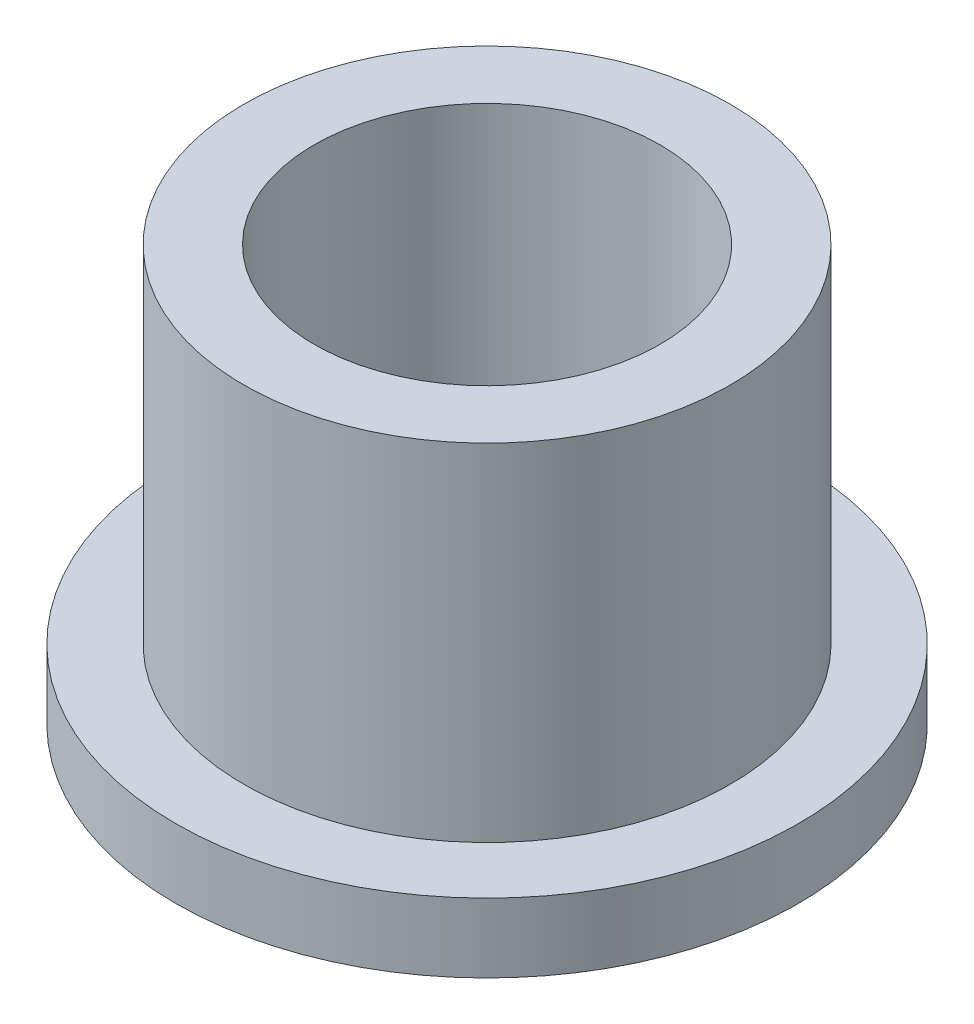
ISO-10303-21;
HEADER;
FILE_DESCRIPTION(('STEP AP214'),'2;1');
FILE_NAME('part.step','',(''),(''),'','','');
FILE_SCHEMA(('AUTOMOTIVE_DESIGN { 1 0 10303 214 1 1 1 1 }'));
ENDSEC;
DATA;
#1=APPLICATION_CONTEXT('core data for automotive mechanical design processes');
#2=APPLICATION_PROTOCOL_DEFINITION('international standard','automotive_design',2000,#1);
#3=PRODUCT_CONTEXT('',#1,'mechanical');
#4=PRODUCT('Part','Part','',(#3));
#5=PRODUCT_RELATED_PRODUCT_CATEGORY('part','',(#4));
#6=PRODUCT_DEFINITION_FORMATION('','',#4);
#7=PRODUCT_DEFINITION_CONTEXT('part definition',#1,'design');
#8=PRODUCT_DEFINITION('design','',#6,#7);
#9=PRODUCT_DEFINITION_SHAPE('','',#8);
#10=(LENGTH_UNIT() NAMED_UNIT(*) SI_UNIT(.MILLI.,.METRE.));
#11=(NAMED_UNIT(*) PLANE_ANGLE_UNIT() SI_UNIT($,.RADIAN.));
#12=(NAMED_UNIT(*) SI_UNIT($,.STERADIAN.) SOLID_ANGLE_UNIT());
#13=UNCERTAINTY_MEASURE_WITH_UNIT(LENGTH_MEASURE(1.E-05),#10,'distance_accuracy_value','');
#14=(GEOMETRIC_REPRESENTATION_CONTEXT(3) GLOBAL_UNCERTAINTY_ASSIGNED_CONTEXT((#13)) GLOBAL_UNIT_ASSIGNED_CONTEXT((#10,
#11,#12)) REPRESENTATION_CONTEXT('',''));
#15=CARTESIAN_POINT('',(0.,0.,0.));
#16=DIRECTION('',(0.,0.,1.));
#17=DIRECTION('',(1.,0.,0.));
#18=AXIS2_PLACEMENT_3D('',#15,#16,#17);
#19=CARTESIAN_POINT('',(0.,9.525,0.));
#20=DIRECTION('',(0.,1.,0.));
#21=DIRECTION('',(0.,0.,1.));
#22=AXIS2_PLACEMENT_3D('',#19,#20,#21);
#23=PLANE('',#22);
#24=CARTESIAN_POINT('',(0.,9.525,0.));
#25=DIRECTION('',(0.,1.,0.));
#26=DIRECTION('',(0.,0.,1.));
#27=AXIS2_PLACEMENT_3D('',#24,#25,#26);
#28=CIRCLE('',#27,5.58165);
#29=CARTESIAN_POINT('',(0.,9.525,-5.58165));
#30=VERTEX_POINT('',#29);
#31=EDGE_CURVE('E10',#30,#30,#28,.T.);
#32=ORIENTED_EDGE('',*,*,#31,.T.);
#33=EDGE_LOOP('',(#32));
#34=FACE_BOUND('',#33,.T.);
#35=CARTESIAN_POINT('',(0.,9.525,0.));
#36=DIRECTION('',(0.,1.,0.));
#37=DIRECTION('',(0.,0.,1.));
#38=AXIS2_PLACEMENT_3D('',#35,#36,#37);
#39=CIRCLE('',#38,3.96875);
#40=CARTESIAN_POINT('',(0.,9.525,-3.96875));
#41=VERTEX_POINT('',#40);
#42=EDGE_CURVE('E39',#41,#41,#39,.T.);
#43=ORIENTED_EDGE('',*,*,#42,.F.);
#44=EDGE_LOOP('',(#43));
#45=FACE_BOUND('',#44,.T.);
#46=ADVANCED_FACE('F32',(#34,#45),#23,.T.);
#47=CARTESIAN_POINT('',(0.,0.,0.));
#48=DIRECTION('',(0.,1.,0.));
#49=DIRECTION('',(0.,0.,1.));
#50=AXIS2_PLACEMENT_3D('',#47,#48,#49);
#51=PLANE('',#50);
#52=CARTESIAN_POINT('',(0.,0.,0.));
#53=DIRECTION('',(0.,1.,0.));
#54=DIRECTION('',(0.,0.,1.));
#55=AXIS2_PLACEMENT_3D('',#52,#53,#54);
#56=CIRCLE('',#55,3.96875);
#57=CARTESIAN_POINT('',(0.,0.,-3.96875));
#58=VERTEX_POINT('',#57);
#59=EDGE_CURVE('E43',#58,#58,#56,.T.);
#60=ORIENTED_EDGE('',*,*,#59,.T.);
#61=EDGE_LOOP('',(#60));
#62=FACE_BOUND('',#61,.T.);
#63=CARTESIAN_POINT('',(0.,0.,0.));
#64=DIRECTION('',(0.,1.,0.));
#65=DIRECTION('',(0.,0.,1.));
#66=AXIS2_PLACEMENT_3D('',#63,#64,#65);
#67=CIRCLE('',#66,7.14375);
#68=CARTESIAN_POINT('',(0.,0.,7.14375));
#69=VERTEX_POINT('',#68);
#70=EDGE_CURVE('E50',#69,#69,#67,.T.);
#71=ORIENTED_EDGE('',*,*,#70,.F.);
#72=EDGE_LOOP('',(#71));
#73=FACE_BOUND('',#72,.T.);
#74=ADVANCED_FACE('F75',(#62,#73),#51,.F.);
#75=CARTESIAN_POINT('',(0.,9.525,0.));
#76=DIRECTION('',(0.,-1.,0.));
#77=DIRECTION('',(0.,0.,-1.));
#78=AXIS2_PLACEMENT_3D('',#75,#76,#77);
#79=CYLINDRICAL_SURFACE('',#78,5.58165);
#80=CARTESIAN_POINT('',(0.,1.5875,0.));
#81=DIRECTION('',(0.,1.,0.));
#82=DIRECTION('',(0.,0.,1.));
#83=AXIS2_PLACEMENT_3D('',#80,#81,#82);
#84=CIRCLE('',#83,5.58165);
#85=CARTESIAN_POINT('',(0.,1.5875,-5.58165));
#86=VERTEX_POINT('',#85);
#87=EDGE_CURVE('E53',#86,#86,#84,.T.);
#88=CARTESIAN_POINT('',(0.,1.5875,-5.58165));
#89=CARTESIAN_POINT('',(0.,1.67018229166667,-5.58165));
#90=CARTESIAN_POINT('',(0.,1.75286458333333,-5.58165));
#91=CARTESIAN_POINT('',(0.,1.91822916666666,-5.58165));
#92=CARTESIAN_POINT('',(0.,2.00091145833333,-5.58165));
#93=CARTESIAN_POINT('',(0.,2.16627604166666,-5.58165));
#94=CARTESIAN_POINT('',(0.,2.24895833333333,-5.58165));
#95=CARTESIAN_POINT('',(0.,2.41432291666667,-5.58165));
#96=CARTESIAN_POINT('',(0.,2.49700520833333,-5.58165));
#97=CARTESIAN_POINT('',(0.,2.66236979166666,-5.58165));
#98=CARTESIAN_POINT('',(0.,2.74505208333333,-5.58165));
#99=CARTESIAN_POINT('',(0.,2.91041666666667,-5.58165));
#100=CARTESIAN_POINT('',(0.,2.99309895833333,-5.58165));
#101=CARTESIAN_POINT('',(0.,3.15846354166667,-5.58165));
#102=CARTESIAN_POINT('',(0.,3.24114583333333,-5.58165));
#103=CARTESIAN_POINT('',(0.,3.40651041666667,-5.58165));
#104=CARTESIAN_POINT('',(0.,3.48919270833333,-5.58165));
#105=CARTESIAN_POINT('',(0.,3.65455729166666,-5.58165));
#106=CARTESIAN_POINT('',(0.,3.73723958333333,-5.58165));
#107=CARTESIAN_POINT('',(0.,3.90260416666667,-5.58165));
#108=CARTESIAN_POINT('',(0.,3.98528645833333,-5.58165));
#109=CARTESIAN_POINT('',(0.,4.15065104166666,-5.58165));
#110=CARTESIAN_POINT('',(0.,4.23333333333333,-5.58165));
#111=CARTESIAN_POINT('',(0.,4.39869791666667,-5.58165));
#112=CARTESIAN_POINT('',(0.,4.48138020833333,-5.58165));
#113=CARTESIAN_POINT('',(0.,4.64674479166667,-5.58165));
#114=CARTESIAN_POINT('',(0.,4.72942708333333,-5.58165));
#115=CARTESIAN_POINT('',(0.,4.89479166666667,-5.58165));
#116=CARTESIAN_POINT('',(0.,4.97747395833333,-5.58165));
#117=CARTESIAN_POINT('',(0.,5.14283854166666,-5.58165));
#118=CARTESIAN_POINT('',(0.,5.22552083333333,-5.58165));
#119=CARTESIAN_POINT('',(0.,5.39088541666667,-5.58165));
#120=CARTESIAN_POINT('',(0.,5.47356770833333,-5.58165));
#121=CARTESIAN_POINT('',(0.,5.63893229166666,-5.58165));
#122=CARTESIAN_POINT('',(0.,5.72161458333333,-5.58165));
#123=CARTESIAN_POINT('',(0.,5.88697916666666,-5.58165));
#124=CARTESIAN_POINT('',(0.,5.96966145833333,-5.58165));
#125=CARTESIAN_POINT('',(0.,6.13502604166666,-5.58165));
#126=CARTESIAN_POINT('',(0.,6.21770833333333,-5.58165));
#127=CARTESIAN_POINT('',(0.,6.38307291666667,-5.58165));
#128=CARTESIAN_POINT('',(0.,6.46575520833333,-5.58165));
#129=CARTESIAN_POINT('',(0.,6.63111979166666,-5.58165));
#130=CARTESIAN_POINT('',(0.,6.71380208333333,-5.58165));
#131=CARTESIAN_POINT('',(0.,6.87916666666666,-5.58165));
#132=CARTESIAN_POINT('',(0.,6.96184895833333,-5.58165));
#133=CARTESIAN_POINT('',(0.,7.12721354166666,-5.58165));
#134=CARTESIAN_POINT('',(0.,7.20989583333333,-5.58165));
#135=CARTESIAN_POINT('',(0.,7.37526041666667,-5.58165));
#136=CARTESIAN_POINT('',(0.,7.45794270833333,-5.58165));
#137=CARTESIAN_POINT('',(0.,7.62330729166666,-5.58165));
#138=CARTESIAN_POINT('',(0.,7.70598958333333,-5.58165));
#139=CARTESIAN_POINT('',(0.,7.87135416666667,-5.58165));
#140=CARTESIAN_POINT('',(0.,7.95403645833333,-5.58165));
#141=CARTESIAN_POINT('',(0.,8.11940104166667,-5.58165));
#142=CARTESIAN_POINT('',(0.,8.20208333333333,-5.58165));
#143=CARTESIAN_POINT('',(0.,8.36744791666667,-5.58165));
#144=CARTESIAN_POINT('',(0.,8.45013020833333,-5.58165));
#145=CARTESIAN_POINT('',(0.,8.61549479166667,-5.58165));
#146=CARTESIAN_POINT('',(0.,8.69817708333333,-5.58165));
#147=CARTESIAN_POINT('',(0.,8.86354166666666,-5.58165));
#148=CARTESIAN_POINT('',(0.,8.94622395833333,-5.58165));
#149=CARTESIAN_POINT('',(0.,9.11158854166667,-5.58165));
#150=CARTESIAN_POINT('',(0.,9.19427083333333,-5.58165));
#151=CARTESIAN_POINT('',(0.,9.35963541666667,-5.58165));
#152=CARTESIAN_POINT('',(0.,9.44231770833333,-5.58165));
#153=CARTESIAN_POINT('',(0.,9.525,-5.58165));
#154=B_SPLINE_CURVE_WITH_KNOTS('',3,(#88,#89,#90,#91,#92,#93,#94,#95,#96,#97,#98,#99,#100,#101,
#102,#103,#104,#105,#106,#107,#108,#109,#110,#111,#112,#113,#114,#115,#116,#117,#118,#119,#120,
#121,#122,#123,#124,#125,#126,#127,#128,#129,#130,#131,#132,#133,#134,#135,#136,#137,#138,#139,
#140,#141,#142,#143,#144,#145,#146,#147,#148,#149,#150,#151,#152,#153),.UNSPECIFIED.,.F.,.F.,(4,
2,2,2,2,2,2,2,2,2,2,2,2,2,2,2,2,2,2,2,2,2,2,2,2,2,2,2,2,2,2,2,4),(0.,0.248046875,
0.496093749999999,0.744140625,0.992187499999999,1.240234375,1.48828125,1.736328125,1.984375,
2.232421875,2.48046875,2.728515625,2.9765625,3.224609375,3.47265625,3.720703125,3.96875,
4.216796875,4.46484375,4.712890625,4.9609375,5.208984375,5.45703125,5.705078125,5.953125,
6.201171875,6.44921875,6.697265625,6.9453125,7.193359375,7.44140625,7.689453125,7.9375),.UNSPECIFIED.);
#155=EDGE_CURVE('BSEAM34',#86,#30,#154,.T.);
#156=ORIENTED_EDGE('',*,*,#87,.T.);
#157=ORIENTED_EDGE('',*,*,#31,.F.);
#158=ORIENTED_EDGE('',*,*,#155,.T.);
#159=ORIENTED_EDGE('',*,*,#155,.F.);
#160=EDGE_LOOP('',(#156,#158,#157,#159));
#161=FACE_BOUND('',#160,.T.);
#162=ADVANCED_FACE('F34',(#161),#79,.T.);
#163=CARTESIAN_POINT('',(0.,9.525,0.));
#164=DIRECTION('',(0.,-1.,0.));
#165=DIRECTION('',(0.,0.,-1.));
#166=AXIS2_PLACEMENT_3D('',#163,#164,#165);
#167=CYLINDRICAL_SURFACE('',#166,3.96875);
#168=CARTESIAN_POINT('',(0.,9.525,-3.96875));
#169=CARTESIAN_POINT('',(0.,9.42578125,-3.96875));
#170=CARTESIAN_POINT('',(0.,9.3265625,-3.96875));
#171=CARTESIAN_POINT('',(0.,9.128125,-3.96875));
#172=CARTESIAN_POINT('',(0.,9.02890625,-3.96875));
#173=CARTESIAN_POINT('',(0.,8.83046875,-3.96875));
#174=CARTESIAN_POINT('',(0.,8.73125,-3.96875));
#175=CARTESIAN_POINT('',(0.,8.5328125,-3.96875));
#176=CARTESIAN_POINT('',(0.,8.43359375,-3.96875));
#177=CARTESIAN_POINT('',(0.,8.23515625,-3.96875));
#178=CARTESIAN_POINT('',(0.,8.1359375,-3.96875));
#179=CARTESIAN_POINT('',(0.,7.9375,-3.96875));
#180=CARTESIAN_POINT('',(0.,7.83828125,-3.96875));
#181=CARTESIAN_POINT('',(0.,7.63984375,-3.96875));
#182=CARTESIAN_POINT('',(0.,7.540625,-3.96875));
#183=CARTESIAN_POINT('',(0.,7.3421875,-3.96875));
#184=CARTESIAN_POINT('',(0.,7.24296875,-3.96875));
#185=CARTESIAN_POINT('',(0.,7.04453125,-3.96875));
#186=CARTESIAN_POINT('',(0.,6.9453125,-3.96875));
#187=CARTESIAN_POINT('',(0.,6.746875,-3.96875));
#188=CARTESIAN_POINT('',(0.,6.64765625,-3.96875));
#189=CARTESIAN_POINT('',(0.,6.44921875,-3.96875));
#190=CARTESIAN_POINT('',(0.,6.35,-3.96875));
#191=CARTESIAN_POINT('',(0.,6.1515625,-3.96875));
#192=CARTESIAN_POINT('',(0.,6.05234375,-3.96875));
#193=CARTESIAN_POINT('',(0.,5.85390625,-3.96875));
#194=CARTESIAN_POINT('',(0.,5.7546875,-3.96875));
#195=CARTESIAN_POINT('',(0.,5.55625,-3.96875));
#196=CARTESIAN_POINT('',(0.,5.45703125,-3.96875));
#197=CARTESIAN_POINT('',(0.,5.25859375,-3.96875));
#198=CARTESIAN_POINT('',(0.,5.159375,-3.96875));
#199=CARTESIAN_POINT('',(0.,4.9609375,-3.96875));
#200=CARTESIAN_POINT('',(0.,4.86171875,-3.96875));
#201=CARTESIAN_POINT('',(0.,4.66328125,-3.96875));
#202=CARTESIAN_POINT('',(0.,4.5640625,-3.96875));
#203=CARTESIAN_POINT('',(0.,4.365625,-3.96875));
#204=CARTESIAN_POINT('',(0.,4.26640625,-3.96875));
#205=CARTESIAN_POINT('',(0.,4.06796875,-3.96875));
#206=CARTESIAN_POINT('',(0.,3.96875,-3.96875));
#207=CARTESIAN_POINT('',(0.,3.7703125,-3.96875));
#208=CARTESIAN_POINT('',(0.,3.67109375,-3.96875));
#209=CARTESIAN_POINT('',(0.,3.47265625,-3.96875));
#210=CARTESIAN_POINT('',(0.,3.3734375,-3.96875));
#211=CARTESIAN_POINT('',(0.,3.175,-3.96875));
#212=CARTESIAN_POINT('',(0.,3.07578125,-3.96875));
#213=CARTESIAN_POINT('',(0.,2.87734375,-3.96875));
#214=CARTESIAN_POINT('',(0.,2.778125,-3.96875));
#215=CARTESIAN_POINT('',(0.,2.5796875,-3.96875));
#216=CARTESIAN_POINT('',(0.,2.48046875,-3.96875));
#217=CARTESIAN_POINT('',(0.,2.28203125,-3.96875));
#218=CARTESIAN_POINT('',(0.,2.1828125,-3.96875));
#219=CARTESIAN_POINT('',(0.,1.984375,-3.96875));
#220=CARTESIAN_POINT('',(0.,1.88515625,-3.96875));
#221=CARTESIAN_POINT('',(0.,1.68671875,-3.96875));
#222=CARTESIAN_POINT('',(0.,1.5875,-3.96875));
#223=CARTESIAN_POINT('',(0.,1.3890625,-3.96875));
#224=CARTESIAN_POINT('',(0.,1.28984375,-3.96875));
#225=CARTESIAN_POINT('',(0.,1.09140625,-3.96875));
#226=CARTESIAN_POINT('',(0.,0.992187500000001,-3.96875));
#227=CARTESIAN_POINT('',(0.,0.793750000000001,-3.96875));
#228=CARTESIAN_POINT('',(0.,0.69453125,-3.96875));
#229=CARTESIAN_POINT('',(0.,0.49609375,-3.96875));
#230=CARTESIAN_POINT('',(0.,0.396875,-3.96875));
#231=CARTESIAN_POINT('',(0.,0.1984375,-3.96875));
#232=CARTESIAN_POINT('',(0.,0.0992187500000001,-3.96875));
#233=CARTESIAN_POINT('',(0.,0.,-3.96875));
#234=B_SPLINE_CURVE_WITH_KNOTS('',3,(#168,#169,#170,#171,#172,#173,#174,#175,#176,#177,#178,
#179,#180,#181,#182,#183,#184,#185,#186,#187,#188,#189,#190,#191,#192,#193,#194,#195,#196,#197,
#198,#199,#200,#201,#202,#203,#204,#205,#206,#207,#208,#209,#210,#211,#212,#213,#214,#215,#216,
#217,#218,#219,#220,#221,#222,#223,#224,#225,#226,#227,#228,#229,#230,#231,#232,#233),
.UNSPECIFIED.,.F.,.F.,(4,2,2,2,2,2,2,2,2,2,2,2,2,2,2,2,2,2,2,2,2,2,2,2,2,2,2,2,2,2,2,2,4),(0.,
0.297656249999998,0.595312499999999,0.892968749999999,1.190625,1.48828125,1.7859375,2.08359375,
2.38125,2.67890625,2.9765625,3.27421875,3.571875,3.86953125,4.1671875,4.46484375,4.7625,
5.06015625,5.3578125,5.65546875,5.953125,6.25078125,6.5484375,6.84609375,7.14375,7.44140625,
7.7390625,8.03671875,8.334375,8.63203125,8.9296875,9.22734375,9.525),.UNSPECIFIED.);
#235=EDGE_CURVE('BSEAM64',#41,#58,#234,.T.);
#236=ORIENTED_EDGE('',*,*,#42,.T.);
#237=ORIENTED_EDGE('',*,*,#59,.F.);
#238=ORIENTED_EDGE('',*,*,#235,.T.);
#239=ORIENTED_EDGE('',*,*,#235,.F.);
#240=EDGE_LOOP('',(#236,#238,#237,#239));
#241=FACE_BOUND('',#240,.T.);
#242=ADVANCED_FACE('F64',(#241),#167,.F.);
#243=CARTESIAN_POINT('',(0.,1.5875,0.));
#244=DIRECTION('',(0.,1.,0.));
#245=DIRECTION('',(0.,0.,1.));
#246=AXIS2_PLACEMENT_3D('',#243,#244,#245);
#247=PLANE('',#246);
#248=CARTESIAN_POINT('',(0.,1.5875,0.));
#249=DIRECTION('',(0.,1.,0.));
#250=DIRECTION('',(0.,0.,1.));
#251=AXIS2_PLACEMENT_3D('',#248,#249,#250);
#252=CIRCLE('',#251,7.14375);
#253=CARTESIAN_POINT('',(0.,1.5875,7.14375));
#254=VERTEX_POINT('',#253);
#255=EDGE_CURVE('E48',#254,#254,#252,.T.);
#256=ORIENTED_EDGE('',*,*,#255,.T.);
#257=EDGE_LOOP('',(#256));
#258=FACE_BOUND('',#257,.T.);
#259=ORIENTED_EDGE('',*,*,#87,.F.);
#260=EDGE_LOOP('',(#259));
#261=FACE_BOUND('',#260,.T.);
#262=ADVANCED_FACE('F61',(#258,#261),#247,.T.);
#263=CARTESIAN_POINT('',(0.,1.5875,0.));
#264=DIRECTION('',(0.,-1.,0.));
#265=DIRECTION('',(0.,0.,-1.));
#266=AXIS2_PLACEMENT_3D('',#263,#264,#265);
#267=CYLINDRICAL_SURFACE('',#266,7.14375);
#268=ORIENTED_EDGE('',*,*,#255,.F.);
#269=EDGE_LOOP('',(#268));
#270=FACE_BOUND('',#269,.T.);
#271=ORIENTED_EDGE('',*,*,#70,.T.);
#272=EDGE_LOOP('',(#271));
#273=FACE_BOUND('',#272,.T.);
#274=ADVANCED_FACE('F63',(#270,#273),#267,.T.);
#275=CLOSED_SHELL('',(#46,#74,#162,#242,#262,#274));
#276=MANIFOLD_SOLID_BREP('B2',#275);
#277=ADVANCED_BREP_SHAPE_REPRESENTATION('',(#18,#276),#14);
#278=SHAPE_DEFINITION_REPRESENTATION(#9,#277);
ENDSEC;
END-ISO-10303-21;
